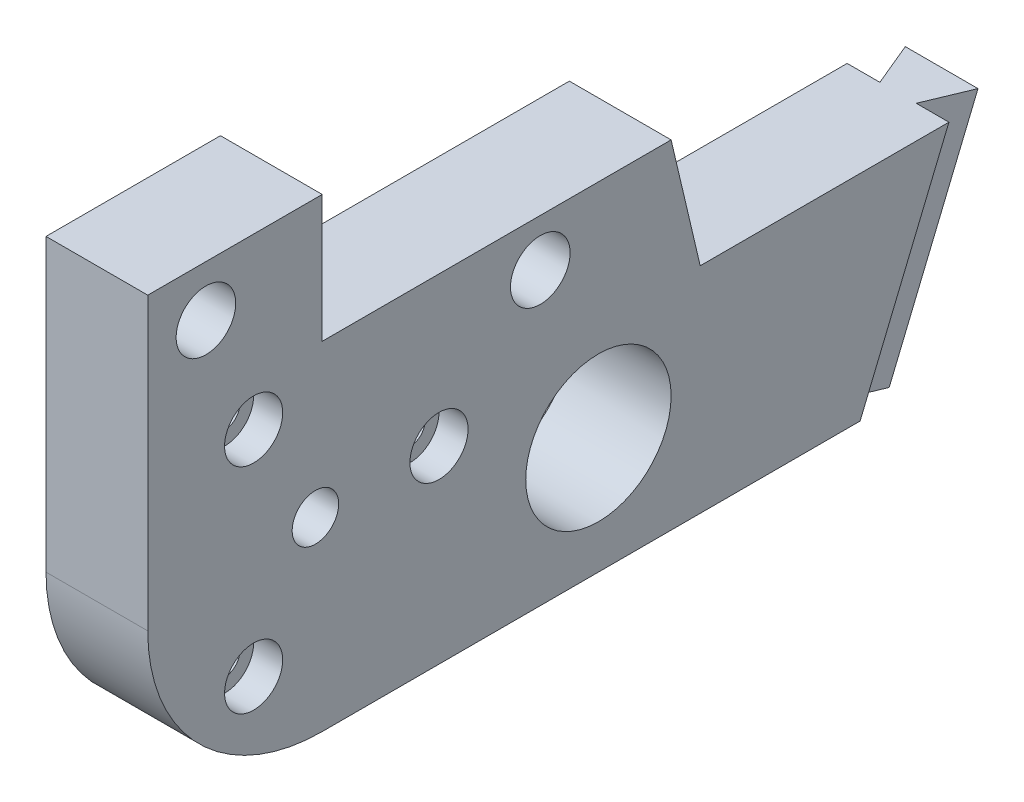
ISO-10303-21;
HEADER;
FILE_DESCRIPTION(('STEP AP214'),'2;1');
FILE_NAME('part.step','',(''),(''),'','','');
FILE_SCHEMA(('AUTOMOTIVE_DESIGN { 1 0 10303 214 1 1 1 1 }'));
ENDSEC;
DATA;
#1=APPLICATION_CONTEXT('core data for automotive mechanical design processes');
#2=APPLICATION_PROTOCOL_DEFINITION('international standard','automotive_design',2000,#1);
#3=PRODUCT_CONTEXT('',#1,'mechanical');
#4=PRODUCT('Part','Part','',(#3));
#5=PRODUCT_RELATED_PRODUCT_CATEGORY('part','',(#4));
#6=PRODUCT_DEFINITION_FORMATION('','',#4);
#7=PRODUCT_DEFINITION_CONTEXT('part definition',#1,'design');
#8=PRODUCT_DEFINITION('design','',#6,#7);
#9=PRODUCT_DEFINITION_SHAPE('','',#8);
#10=(LENGTH_UNIT() NAMED_UNIT(*) SI_UNIT(.MILLI.,.METRE.));
#11=(NAMED_UNIT(*) PLANE_ANGLE_UNIT() SI_UNIT($,.RADIAN.));
#12=(NAMED_UNIT(*) SI_UNIT($,.STERADIAN.) SOLID_ANGLE_UNIT());
#13=UNCERTAINTY_MEASURE_WITH_UNIT(LENGTH_MEASURE(1.E-05),#10,'distance_accuracy_value','');
#14=(GEOMETRIC_REPRESENTATION_CONTEXT(3) GLOBAL_UNCERTAINTY_ASSIGNED_CONTEXT((#13)) GLOBAL_UNIT_ASSIGNED_CONTEXT((#10,
#11,#12)) REPRESENTATION_CONTEXT('',''));
#15=CARTESIAN_POINT('',(0.,0.,0.));
#16=DIRECTION('',(0.,0.,1.));
#17=DIRECTION('',(1.,0.,0.));
#18=AXIS2_PLACEMENT_3D('',#15,#16,#17);
#19=CARTESIAN_POINT('',(5.,-7.99999999999999,-1.));
#20=DIRECTION('',(0.,-1.,0.));
#21=DIRECTION('',(0.,0.,-1.));
#22=AXIS2_PLACEMENT_3D('',#19,#20,#21);
#23=PLANE('',#22);
#24=DIRECTION('',(1.,0.,0.));
#25=VECTOR('',#24,1.);
#26=CARTESIAN_POINT('',(5.,-7.99999999999999,47.));
#27=LINE('',#26,#25);
#28=CARTESIAN_POINT('',(12.,-7.99999999999999,47.));
#29=VERTEX_POINT('',#28);
#30=CARTESIAN_POINT('',(5.,-7.99999999999999,47.));
#31=VERTEX_POINT('',#30);
#32=EDGE_CURVE('E151',#29,#31,#27,.F.);
#33=ORIENTED_EDGE('',*,*,#32,.T.);
#34=DIRECTION('',(0.,0.,-1.));
#35=VECTOR('',#34,1.);
#36=CARTESIAN_POINT('',(5.,-7.99999999999999,-1.));
#37=LINE('',#36,#35);
#38=CARTESIAN_POINT('',(5.,-7.99999999999999,10.));
#39=VERTEX_POINT('',#38);
#40=EDGE_CURVE('E139',#31,#39,#37,.T.);
#41=ORIENTED_EDGE('',*,*,#40,.T.);
#42=DIRECTION('',(-1.,0.,0.));
#43=VECTOR('',#42,1.);
#44=CARTESIAN_POINT('',(5.,-7.99999999999999,10.));
#45=LINE('',#44,#43);
#46=CARTESIAN_POINT('',(7.25,-7.99999999999999,10.));
#47=VERTEX_POINT('',#46);
#48=EDGE_CURVE('E201',#47,#39,#45,.T.);
#49=ORIENTED_EDGE('',*,*,#48,.F.);
#50=DIRECTION('',(0.384615384615385,0.,0.923076923076923));
#51=VECTOR('',#50,1.);
#52=CARTESIAN_POINT('',(7.3972403979656,-7.99999999999999,10.3533769551174));
#53=LINE('',#52,#51);
#54=CARTESIAN_POINT('',(6.,-7.99999999999999,7.));
#55=VERTEX_POINT('',#54);
#56=EDGE_CURVE('E173',#55,#47,#53,.T.);
#57=ORIENTED_EDGE('',*,*,#56,.F.);
#58=DIRECTION('',(1.,0.,0.));
#59=VECTOR('',#58,1.);
#60=CARTESIAN_POINT('',(-2.,-7.99999999999999,7.));
#61=LINE('',#60,#59);
#62=CARTESIAN_POINT('',(11.,-7.99999999999999,7.));
#63=VERTEX_POINT('',#62);
#64=EDGE_CURVE('E256',#55,#63,#61,.T.);
#65=ORIENTED_EDGE('',*,*,#64,.T.);
#66=DIRECTION('',(0.384615384615385,0.,-0.923076923076923));
#67=VECTOR('',#66,1.);
#68=CARTESIAN_POINT('',(9.6027596020344,-7.99999999999999,10.3533769551174));
#69=LINE('',#68,#67);
#70=CARTESIAN_POINT('',(9.75,-7.99999999999999,10.));
#71=VERTEX_POINT('',#70);
#72=EDGE_CURVE('E267',#71,#63,#69,.T.);
#73=ORIENTED_EDGE('',*,*,#72,.F.);
#74=DIRECTION('',(-1.,0.,0.));
#75=VECTOR('',#74,1.);
#76=CARTESIAN_POINT('',(12.,-7.99999999999999,10.));
#77=LINE('',#76,#75);
#78=CARTESIAN_POINT('',(12.,-7.99999999999999,10.));
#79=VERTEX_POINT('',#78);
#80=EDGE_CURVE('E271',#79,#71,#77,.T.);
#81=ORIENTED_EDGE('',*,*,#80,.F.);
#82=DIRECTION('',(0.,0.,1.));
#83=VECTOR('',#82,1.);
#84=CARTESIAN_POINT('',(12.,-7.99999999999999,-1.));
#85=LINE('',#84,#83);
#86=EDGE_CURVE('E50',#79,#29,#85,.T.);
#87=ORIENTED_EDGE('',*,*,#86,.T.);
#88=EDGE_LOOP('',(#33,#41,#49,#57,#65,#73,#81,#87));
#89=FACE_BOUND('',#88,.T.);
#90=ADVANCED_FACE('F35',(#89),#23,.T.);
#91=CARTESIAN_POINT('',(-2.,6.75,-4.00000000000001));
#92=DIRECTION('',(0.,-1.,0.));
#93=DIRECTION('',(0.,0.,-1.));
#94=AXIS2_PLACEMENT_3D('',#91,#92,#93);
#95=PLANE('',#94);
#96=DIRECTION('',(0.,0.,-1.));
#97=VECTOR('',#96,1.);
#98=CARTESIAN_POINT('',(5.,6.75,-4.00000000000001));
#99=LINE('',#98,#97);
#100=CARTESIAN_POINT('',(5.,6.75,21.));
#101=VERTEX_POINT('',#100);
#102=CARTESIAN_POINT('',(5.,6.75,3.89034995499695));
#103=VERTEX_POINT('',#102);
#104=EDGE_CURVE('E230',#101,#103,#99,.T.);
#105=ORIENTED_EDGE('',*,*,#104,.F.);
#106=DIRECTION('',(1.,0.,0.));
#107=VECTOR('',#106,1.);
#108=CARTESIAN_POINT('',(-2.,6.75,21.));
#109=LINE('',#108,#107);
#110=CARTESIAN_POINT('',(12.,6.75,21.));
#111=VERTEX_POINT('',#110);
#112=EDGE_CURVE('E178',#101,#111,#109,.T.);
#113=ORIENTED_EDGE('',*,*,#112,.T.);
#114=DIRECTION('',(0.,0.,-1.));
#115=VECTOR('',#114,1.);
#116=CARTESIAN_POINT('',(12.,6.75,-4.00000000000001));
#117=LINE('',#116,#115);
#118=CARTESIAN_POINT('',(12.,6.75,3.89034995499695));
#119=VERTEX_POINT('',#118);
#120=EDGE_CURVE('E172',#111,#119,#117,.T.);
#121=ORIENTED_EDGE('',*,*,#120,.T.);
#122=DIRECTION('',(1.,0.,0.));
#123=VECTOR('',#122,1.);
#124=CARTESIAN_POINT('',(-2.,6.75,3.89034995499695));
#125=LINE('',#124,#123);
#126=CARTESIAN_POINT('',(9.75,6.75,3.89034995499695));
#127=VERTEX_POINT('',#126);
#128=EDGE_CURVE('E43',#127,#119,#125,.T.);
#129=ORIENTED_EDGE('',*,*,#128,.F.);
#130=DIRECTION('',(-0.384615384615385,0.,0.923076923076923));
#131=VECTOR('',#130,1.);
#132=CARTESIAN_POINT('',(10.8131419958569,6.75,1.33880916494037));
#133=LINE('',#132,#131);
#134=CARTESIAN_POINT('',(11.,6.75,0.89034995499695));
#135=VERTEX_POINT('',#134);
#136=EDGE_CURVE('E156',#135,#127,#133,.T.);
#137=ORIENTED_EDGE('',*,*,#136,.F.);
#138=DIRECTION('',(1.,0.,0.));
#139=VECTOR('',#138,1.);
#140=CARTESIAN_POINT('',(-2.,6.75,0.89034995499695));
#141=LINE('',#140,#139);
#142=CARTESIAN_POINT('',(6.,6.75,0.89034995499695));
#143=VERTEX_POINT('',#142);
#144=EDGE_CURVE('E255',#143,#135,#141,.T.);
#145=ORIENTED_EDGE('',*,*,#144,.F.);
#146=DIRECTION('',(-0.384615384615385,0.,-0.923076923076923));
#147=VECTOR('',#146,1.);
#148=CARTESIAN_POINT('',(3.08034912840345,6.75,-6.11681213683478));
#149=LINE('',#148,#147);
#150=CARTESIAN_POINT('',(7.25,6.75,3.89034995499695));
#151=VERTEX_POINT('',#150);
#152=EDGE_CURVE('E11',#151,#143,#149,.T.);
#153=ORIENTED_EDGE('',*,*,#152,.F.);
#154=DIRECTION('',(1.,0.,0.));
#155=VECTOR('',#154,1.);
#156=CARTESIAN_POINT('',(-2.,6.75,3.89034995499695));
#157=LINE('',#156,#155);
#158=EDGE_CURVE('E204',#103,#151,#157,.T.);
#159=ORIENTED_EDGE('',*,*,#158,.F.);
#160=EDGE_LOOP('',(#105,#113,#121,#129,#137,#145,#153,#159));
#161=FACE_BOUND('',#160,.T.);
#162=ADVANCED_FACE('F176',(#161),#95,.F.);
#163=CARTESIAN_POINT('',(-2.,15.25,47.));
#164=DIRECTION('',(0.,-1.,0.));
#165=DIRECTION('',(0.,0.,-1.));
#166=AXIS2_PLACEMENT_3D('',#163,#164,#165);
#167=PLANE('',#166);
#168=DIRECTION('',(0.,0.,-1.));
#169=VECTOR('',#168,1.);
#170=CARTESIAN_POINT('',(5.,15.25,47.));
#171=LINE('',#170,#169);
#172=CARTESIAN_POINT('',(5.,15.25,47.));
#173=VERTEX_POINT('',#172);
#174=CARTESIAN_POINT('',(5.,15.25,23.));
#175=VERTEX_POINT('',#174);
#176=EDGE_CURVE('E218',#173,#175,#171,.T.);
#177=ORIENTED_EDGE('',*,*,#176,.F.);
#178=DIRECTION('',(1.,0.,0.));
#179=VECTOR('',#178,1.);
#180=CARTESIAN_POINT('',(-2.,15.25,47.));
#181=LINE('',#180,#179);
#182=CARTESIAN_POINT('',(12.,15.25,47.));
#183=VERTEX_POINT('',#182);
#184=EDGE_CURVE('E208',#173,#183,#181,.T.);
#185=ORIENTED_EDGE('',*,*,#184,.T.);
#186=DIRECTION('',(0.,0.,-1.));
#187=VECTOR('',#186,1.);
#188=CARTESIAN_POINT('',(12.,15.25,47.));
#189=LINE('',#188,#187);
#190=CARTESIAN_POINT('',(12.,15.25,23.));
#191=VERTEX_POINT('',#190);
#192=EDGE_CURVE('E192',#183,#191,#189,.T.);
#193=ORIENTED_EDGE('',*,*,#192,.T.);
#194=DIRECTION('',(1.,0.,0.));
#195=VECTOR('',#194,1.);
#196=CARTESIAN_POINT('',(-2.,15.25,23.));
#197=LINE('',#196,#195);
#198=EDGE_CURVE('E206',#175,#191,#197,.T.);
#199=ORIENTED_EDGE('',*,*,#198,.F.);
#200=EDGE_LOOP('',(#177,#185,#193,#199));
#201=FACE_BOUND('',#200,.T.);
#202=ADVANCED_FACE('F215',(#201),#167,.F.);
#203=CARTESIAN_POINT('',(5.,24.,59.));
#204=DIRECTION('',(0.,1.,0.));
#205=DIRECTION('',(0.,0.,1.));
#206=AXIS2_PLACEMENT_3D('',#203,#204,#205);
#207=PLANE('',#206);
#208=DIRECTION('',(1.,0.,0.));
#209=VECTOR('',#208,1.);
#210=CARTESIAN_POINT('',(-2.,24.,47.));
#211=LINE('',#210,#209);
#212=CARTESIAN_POINT('',(5.,24.,47.));
#213=VERTEX_POINT('',#212);
#214=CARTESIAN_POINT('',(12.,24.,47.));
#215=VERTEX_POINT('',#214);
#216=EDGE_CURVE('E210',#213,#215,#211,.T.);
#217=ORIENTED_EDGE('',*,*,#216,.F.);
#218=DIRECTION('',(0.,0.,1.));
#219=VECTOR('',#218,1.);
#220=CARTESIAN_POINT('',(5.,24.,59.));
#221=LINE('',#220,#219);
#222=CARTESIAN_POINT('',(5.,24.,59.));
#223=VERTEX_POINT('',#222);
#224=EDGE_CURVE('E148',#213,#223,#221,.T.);
#225=ORIENTED_EDGE('',*,*,#224,.T.);
#226=DIRECTION('',(-1.,0.,0.));
#227=VECTOR('',#226,1.);
#228=CARTESIAN_POINT('',(5.,24.,59.));
#229=LINE('',#228,#227);
#230=CARTESIAN_POINT('',(12.,24.,59.));
#231=VERTEX_POINT('',#230);
#232=EDGE_CURVE('E141',#231,#223,#229,.T.);
#233=ORIENTED_EDGE('',*,*,#232,.F.);
#234=DIRECTION('',(0.,0.,-1.));
#235=VECTOR('',#234,1.);
#236=CARTESIAN_POINT('',(12.,24.,59.));
#237=LINE('',#236,#235);
#238=EDGE_CURVE('E198',#231,#215,#237,.T.);
#239=ORIENTED_EDGE('',*,*,#238,.T.);
#240=EDGE_LOOP('',(#217,#225,#233,#239));
#241=FACE_BOUND('',#240,.T.);
#242=ADVANCED_FACE('F364',(#241),#207,.T.);
#243=CARTESIAN_POINT('',(5.,-7.99999999999999,59.));
#244=DIRECTION('',(0.,0.,1.));
#245=DIRECTION('',(0.,-1.,0.));
#246=AXIS2_PLACEMENT_3D('',#243,#244,#245);
#247=PLANE('',#246);
#248=ORIENTED_EDGE('',*,*,#232,.T.);
#249=DIRECTION('',(0.,-1.,0.));
#250=VECTOR('',#249,1.);
#251=CARTESIAN_POINT('',(5.,-7.99999999999999,59.));
#252=LINE('',#251,#250);
#253=CARTESIAN_POINT('',(5.,4.00000000000001,59.));
#254=VERTEX_POINT('',#253);
#255=EDGE_CURVE('E136',#223,#254,#252,.T.);
#256=ORIENTED_EDGE('',*,*,#255,.T.);
#257=DIRECTION('',(1.,0.,0.));
#258=VECTOR('',#257,1.);
#259=CARTESIAN_POINT('',(5.,4.00000000000001,59.));
#260=LINE('',#259,#258);
#261=CARTESIAN_POINT('',(12.,4.00000000000001,59.));
#262=VERTEX_POINT('',#261);
#263=EDGE_CURVE('E140',#254,#262,#260,.T.);
#264=ORIENTED_EDGE('',*,*,#263,.T.);
#265=DIRECTION('',(0.,1.,0.));
#266=VECTOR('',#265,1.);
#267=CARTESIAN_POINT('',(12.,-7.99999999999999,59.));
#268=LINE('',#267,#266);
#269=EDGE_CURVE('E195',#262,#231,#268,.T.);
#270=ORIENTED_EDGE('',*,*,#269,.T.);
#271=EDGE_LOOP('',(#248,#256,#264,#270));
#272=FACE_BOUND('',#271,.T.);
#273=ADVANCED_FACE('F145',(#272),#247,.T.);
#274=CARTESIAN_POINT('',(-2.,24.,47.));
#275=DIRECTION('',(0.,0.,1.));
#276=DIRECTION('',(1.,0.,0.));
#277=AXIS2_PLACEMENT_3D('',#274,#275,#276);
#278=PLANE('',#277);
#279=DIRECTION('',(0.,-1.,0.));
#280=VECTOR('',#279,1.);
#281=CARTESIAN_POINT('',(5.,24.,47.));
#282=LINE('',#281,#280);
#283=EDGE_CURVE('E664',#213,#173,#282,.T.);
#284=ORIENTED_EDGE('',*,*,#283,.F.);
#285=ORIENTED_EDGE('',*,*,#216,.T.);
#286=DIRECTION('',(0.,-1.,0.));
#287=VECTOR('',#286,1.);
#288=CARTESIAN_POINT('',(12.,24.,47.));
#289=LINE('',#288,#287);
#290=EDGE_CURVE('E183',#215,#183,#289,.T.);
#291=ORIENTED_EDGE('',*,*,#290,.T.);
#292=ORIENTED_EDGE('',*,*,#184,.F.);
#293=EDGE_LOOP('',(#284,#285,#291,#292));
#294=FACE_BOUND('',#293,.T.);
#295=ADVANCED_FACE('F222',(#294),#278,.F.);
#296=CARTESIAN_POINT('',(-2.,6.75,21.));
#297=DIRECTION('',(0.,-0.229039333725547,0.973417168333576));
#298=DIRECTION('',(0.,-0.973417168333576,-0.229039333725547));
#299=AXIS2_PLACEMENT_3D('',#296,#297,#298);
#300=PLANE('',#299);
#301=DIRECTION('',(0.,-0.973417168333576,-0.229039333725547));
#302=VECTOR('',#301,1.);
#303=CARTESIAN_POINT('',(5.,6.75,21.));
#304=LINE('',#303,#302);
#305=EDGE_CURVE('E228',#175,#101,#304,.T.);
#306=ORIENTED_EDGE('',*,*,#305,.F.);
#307=ORIENTED_EDGE('',*,*,#198,.T.);
#308=DIRECTION('',(0.,-0.973417168333576,-0.229039333725547));
#309=VECTOR('',#308,1.);
#310=CARTESIAN_POINT('',(12.,6.75,21.));
#311=LINE('',#310,#309);
#312=EDGE_CURVE('E180',#191,#111,#311,.T.);
#313=ORIENTED_EDGE('',*,*,#312,.T.);
#314=ORIENTED_EDGE('',*,*,#112,.F.);
#315=EDGE_LOOP('',(#306,#307,#313,#314));
#316=FACE_BOUND('',#315,.T.);
#317=ADVANCED_FACE('F227',(#316),#300,.F.);
#318=CARTESIAN_POINT('',(-2.,0.,28.));
#319=DIRECTION('',(-1.,0.,0.));
#320=DIRECTION('',(0.,0.,1.));
#321=AXIS2_PLACEMENT_3D('',#318,#319,#320);
#322=CYLINDRICAL_SURFACE('',#321,4.99999999999999);
#323=CARTESIAN_POINT('',(12.,0.,28.));
#324=DIRECTION('',(1.,0.,0.));
#325=DIRECTION('',(0.,0.,-1.));
#326=AXIS2_PLACEMENT_3D('',#323,#324,#325);
#327=CIRCLE('',#326,4.99999999999999);
#328=CARTESIAN_POINT('',(12.,0.,23.));
#329=VERTEX_POINT('',#328);
#330=EDGE_CURVE('E181',#329,#329,#327,.T.);
#331=ORIENTED_EDGE('',*,*,#330,.T.);
#332=EDGE_LOOP('',(#331));
#333=FACE_BOUND('',#332,.T.);
#334=CARTESIAN_POINT('',(5.,0.,28.));
#335=DIRECTION('',(-1.,0.,0.));
#336=DIRECTION('',(0.,0.,1.));
#337=AXIS2_PLACEMENT_3D('',#334,#335,#336);
#338=CIRCLE('',#337,4.99999999999999);
#339=CARTESIAN_POINT('',(5.,0.,33.));
#340=VERTEX_POINT('',#339);
#341=EDGE_CURVE('E252',#340,#340,#338,.F.);
#342=ORIENTED_EDGE('',*,*,#341,.F.);
#343=EDGE_LOOP('',(#342));
#344=FACE_BOUND('',#343,.T.);
#345=ADVANCED_FACE('F340',(#333,#344),#322,.F.);
#346=CARTESIAN_POINT('',(-2.,12.3612159321677,51.7181791649861));
#347=DIRECTION('',(-1.,0.,0.));
#348=DIRECTION('',(0.,0.,1.));
#349=AXIS2_PLACEMENT_3D('',#346,#347,#348);
#350=CYLINDRICAL_SURFACE('',#349,1.05000000000001);
#351=CARTESIAN_POINT('',(10.,12.3612159321677,51.7181791649861));
#352=DIRECTION('',(1.,0.,0.));
#353=DIRECTION('',(0.,0.,-1.));
#354=AXIS2_PLACEMENT_3D('',#351,#352,#353);
#355=CIRCLE('',#354,1.05000000000001);
#356=CARTESIAN_POINT('',(10.,12.3612159321677,50.6681791649861));
#357=VERTEX_POINT('',#356);
#358=EDGE_CURVE('E186',#357,#357,#355,.T.);
#359=ORIENTED_EDGE('',*,*,#358,.T.);
#360=EDGE_LOOP('',(#359));
#361=FACE_BOUND('',#360,.T.);
#362=CARTESIAN_POINT('',(5.,12.3612159321677,51.7181791649861));
#363=DIRECTION('',(-1.,0.,0.));
#364=DIRECTION('',(0.,0.,1.));
#365=AXIS2_PLACEMENT_3D('',#362,#363,#364);
#366=CIRCLE('',#365,1.05000000000001);
#367=CARTESIAN_POINT('',(5.,12.3612159321677,52.7681791649862));
#368=VERTEX_POINT('',#367);
#369=EDGE_CURVE('E249',#368,#368,#366,.F.);
#370=ORIENTED_EDGE('',*,*,#369,.F.);
#371=EDGE_LOOP('',(#370));
#372=FACE_BOUND('',#371,.T.);
#373=ADVANCED_FACE('F317',(#361,#372),#350,.F.);
#374=CARTESIAN_POINT('',(-2.,-2.36121593216772,51.7181791649861));
#375=DIRECTION('',(-1.,0.,0.));
#376=DIRECTION('',(0.,0.,1.));
#377=AXIS2_PLACEMENT_3D('',#374,#375,#376);
#378=CYLINDRICAL_SURFACE('',#377,1.05000000000001);
#379=CARTESIAN_POINT('',(10.,-2.36121593216772,51.7181791649861));
#380=DIRECTION('',(1.,0.,0.));
#381=DIRECTION('',(0.,0.,-1.));
#382=AXIS2_PLACEMENT_3D('',#379,#380,#381);
#383=CIRCLE('',#382,1.05000000000001);
#384=CARTESIAN_POINT('',(10.,-2.36121593216772,50.6681791649861));
#385=VERTEX_POINT('',#384);
#386=EDGE_CURVE('E306',#385,#385,#383,.T.);
#387=ORIENTED_EDGE('',*,*,#386,.T.);
#388=EDGE_LOOP('',(#387));
#389=FACE_BOUND('',#388,.T.);
#390=CARTESIAN_POINT('',(5.,-2.36121593216772,51.7181791649861));
#391=DIRECTION('',(-1.,0.,0.));
#392=DIRECTION('',(0.,0.,1.));
#393=AXIS2_PLACEMENT_3D('',#390,#391,#392);
#394=CIRCLE('',#393,1.05000000000001);
#395=CARTESIAN_POINT('',(5.,-2.36121593216772,52.7681791649862));
#396=VERTEX_POINT('',#395);
#397=EDGE_CURVE('E246',#396,#396,#394,.F.);
#398=ORIENTED_EDGE('',*,*,#397,.F.);
#399=EDGE_LOOP('',(#398));
#400=FACE_BOUND('',#399,.T.);
#401=ADVANCED_FACE('F419',(#389,#400),#378,.F.);
#402=CARTESIAN_POINT('',(-2.,4.99999999999998,38.9681791649861));
#403=DIRECTION('',(-1.,0.,0.));
#404=DIRECTION('',(0.,0.,1.));
#405=AXIS2_PLACEMENT_3D('',#402,#403,#404);
#406=CYLINDRICAL_SURFACE('',#405,1.05000000000001);
#407=CARTESIAN_POINT('',(10.,4.99999999999998,38.9681791649861));
#408=DIRECTION('',(1.,0.,0.));
#409=DIRECTION('',(0.,0.,-1.));
#410=AXIS2_PLACEMENT_3D('',#407,#408,#409);
#411=CIRCLE('',#410,1.05000000000001);
#412=CARTESIAN_POINT('',(10.,4.99999999999998,37.9181791649861));
#413=VERTEX_POINT('',#412);
#414=EDGE_CURVE('E297',#413,#413,#411,.T.);
#415=ORIENTED_EDGE('',*,*,#414,.T.);
#416=EDGE_LOOP('',(#415));
#417=FACE_BOUND('',#416,.T.);
#418=CARTESIAN_POINT('',(5.,4.99999999999998,38.9681791649861));
#419=DIRECTION('',(-1.,0.,0.));
#420=DIRECTION('',(0.,0.,1.));
#421=AXIS2_PLACEMENT_3D('',#418,#419,#420);
#422=CIRCLE('',#421,1.05000000000001);
#423=CARTESIAN_POINT('',(5.,4.99999999999998,40.0181791649862));
#424=VERTEX_POINT('',#423);
#425=EDGE_CURVE('E243',#424,#424,#422,.F.);
#426=ORIENTED_EDGE('',*,*,#425,.F.);
#427=EDGE_LOOP('',(#426));
#428=FACE_BOUND('',#427,.T.);
#429=ADVANCED_FACE('F429',(#417,#428),#406,.F.);
#430=CARTESIAN_POINT('',(5.,5.,47.4681791649861));
#431=DIRECTION('',(1.,0.,0.));
#432=DIRECTION('',(0.,0.,-1.));
#433=AXIS2_PLACEMENT_3D('',#430,#431,#432);
#434=CYLINDRICAL_SURFACE('',#433,5.1);
#435=CARTESIAN_POINT('',(6.,5.,47.4681791649861));
#436=DIRECTION('',(-1.,0.,0.));
#437=DIRECTION('',(0.,0.,1.));
#438=AXIS2_PLACEMENT_3D('',#435,#436,#437);
#439=CIRCLE('',#438,5.1);
#440=CARTESIAN_POINT('',(6.,5.,52.5681791649861));
#441=VERTEX_POINT('',#440);
#442=EDGE_CURVE('E282',#441,#441,#439,.T.);
#443=ORIENTED_EDGE('',*,*,#442,.F.);
#444=EDGE_LOOP('',(#443));
#445=FACE_BOUND('',#444,.T.);
#446=CARTESIAN_POINT('',(5.,5.,47.4681791649861));
#447=DIRECTION('',(-1.,0.,0.));
#448=DIRECTION('',(0.,0.,1.));
#449=AXIS2_PLACEMENT_3D('',#446,#447,#448);
#450=CIRCLE('',#449,5.1);
#451=CARTESIAN_POINT('',(5.,5.,52.5681791649861));
#452=VERTEX_POINT('',#451);
#453=EDGE_CURVE('E240',#452,#452,#450,.F.);
#454=ORIENTED_EDGE('',*,*,#453,.F.);
#455=EDGE_LOOP('',(#454));
#456=FACE_BOUND('',#455,.T.);
#457=ADVANCED_FACE('F440',(#445,#456),#434,.F.);
#458=CARTESIAN_POINT('',(-2.,12.,32.));
#459=DIRECTION('',(-1.,0.,0.));
#460=DIRECTION('',(0.,0.,1.));
#461=AXIS2_PLACEMENT_3D('',#458,#459,#460);
#462=CYLINDRICAL_SURFACE('',#461,2.04999999999999);
#463=CARTESIAN_POINT('',(12.,12.,32.));
#464=DIRECTION('',(1.,0.,0.));
#465=DIRECTION('',(0.,0.,-1.));
#466=AXIS2_PLACEMENT_3D('',#463,#464,#465);
#467=CIRCLE('',#466,2.04999999999998);
#468=CARTESIAN_POINT('',(12.,12.,29.95));
#469=VERTEX_POINT('',#468);
#470=EDGE_CURVE('E279',#469,#469,#467,.T.);
#471=ORIENTED_EDGE('',*,*,#470,.T.);
#472=EDGE_LOOP('',(#471));
#473=FACE_BOUND('',#472,.T.);
#474=CARTESIAN_POINT('',(5.,12.,32.));
#475=DIRECTION('',(-1.,0.,0.));
#476=DIRECTION('',(0.,0.,1.));
#477=AXIS2_PLACEMENT_3D('',#474,#475,#476);
#478=CIRCLE('',#477,2.04999999999999);
#479=CARTESIAN_POINT('',(5.,12.,34.05));
#480=VERTEX_POINT('',#479);
#481=EDGE_CURVE('E233',#480,#480,#478,.F.);
#482=ORIENTED_EDGE('',*,*,#481,.F.);
#483=EDGE_LOOP('',(#482));
#484=FACE_BOUND('',#483,.T.);
#485=ADVANCED_FACE('F451',(#473,#484),#462,.F.);
#486=CARTESIAN_POINT('',(5.,20.5,55.));
#487=DIRECTION('',(1.,0.,0.));
#488=DIRECTION('',(0.,0.,-1.));
#489=AXIS2_PLACEMENT_3D('',#486,#487,#488);
#490=CYLINDRICAL_SURFACE('',#489,2.04999999999999);
#491=CARTESIAN_POINT('',(12.,20.5,55.));
#492=DIRECTION('',(-1.,0.,0.));
#493=DIRECTION('',(0.,0.,1.));
#494=AXIS2_PLACEMENT_3D('',#491,#492,#493);
#495=CIRCLE('',#494,2.05);
#496=CARTESIAN_POINT('',(12.,20.5,57.05));
#497=VERTEX_POINT('',#496);
#498=EDGE_CURVE('E270',#497,#497,#495,.T.);
#499=ORIENTED_EDGE('',*,*,#498,.F.);
#500=EDGE_LOOP('',(#499));
#501=FACE_BOUND('',#500,.T.);
#502=CARTESIAN_POINT('',(5.,20.5,55.));
#503=DIRECTION('',(-1.,0.,0.));
#504=DIRECTION('',(0.,0.,1.));
#505=AXIS2_PLACEMENT_3D('',#502,#503,#504);
#506=CIRCLE('',#505,2.04999999999999);
#507=CARTESIAN_POINT('',(5.,20.5,57.05));
#508=VERTEX_POINT('',#507);
#509=EDGE_CURVE('E229',#508,#508,#506,.F.);
#510=ORIENTED_EDGE('',*,*,#509,.F.);
#511=EDGE_LOOP('',(#510));
#512=FACE_BOUND('',#511,.T.);
#513=ADVANCED_FACE('F462',(#501,#512),#490,.F.);
#514=CARTESIAN_POINT('',(5.,-9.00123984004869,10.4147271209364));
#515=DIRECTION('',(0.,-0.382683432365084,-0.923879532511289));
#516=DIRECTION('',(0.,0.923879532511289,-0.382683432365084));
#517=AXIS2_PLACEMENT_3D('',#514,#515,#516);
#518=PLANE('',#517);
#519=ORIENTED_EDGE('',*,*,#48,.T.);
#520=DIRECTION('',(0.,0.923879532511289,-0.382683432365084));
#521=VECTOR('',#520,1.);
#522=CARTESIAN_POINT('',(5.,-9.00123984004869,10.4147271209364));
#523=LINE('',#522,#521);
#524=EDGE_CURVE('E663',#39,#103,#523,.T.);
#525=ORIENTED_EDGE('',*,*,#524,.T.);
#526=ORIENTED_EDGE('',*,*,#158,.T.);
#527=DIRECTION('',(0.,0.923879532511289,-0.382683432365084));
#528=VECTOR('',#527,1.);
#529=CARTESIAN_POINT('',(7.25,-9.00123984004869,10.4147271209364));
#530=LINE('',#529,#528);
#531=EDGE_CURVE('E263',#47,#151,#530,.T.);
#532=ORIENTED_EDGE('',*,*,#531,.F.);
#533=EDGE_LOOP('',(#519,#525,#526,#532));
#534=FACE_BOUND('',#533,.T.);
#535=ADVANCED_FACE('F335',(#534),#518,.T.);
#536=CARTESIAN_POINT('',(12.,0.,0.));
#537=DIRECTION('',(1.,0.,0.));
#538=DIRECTION('',(0.,0.,1.));
#539=AXIS2_PLACEMENT_3D('',#536,#537,#538);
#540=PLANE('',#539);
#541=ORIENTED_EDGE('',*,*,#498,.T.);
#542=EDGE_LOOP('',(#541));
#543=FACE_BOUND('',#542,.T.);
#544=ORIENTED_EDGE('',*,*,#470,.F.);
#545=EDGE_LOOP('',(#544));
#546=FACE_BOUND('',#545,.T.);
#547=CARTESIAN_POINT('',(12.,5.,47.4681791649861));
#548=DIRECTION('',(-1.,0.,0.));
#549=DIRECTION('',(0.,0.,1.));
#550=AXIS2_PLACEMENT_3D('',#547,#548,#549);
#551=CIRCLE('',#550,1.6);
#552=CARTESIAN_POINT('',(12.,5.,49.0681791649861));
#553=VERTEX_POINT('',#552);
#554=EDGE_CURVE('E288',#553,#553,#551,.T.);
#555=ORIENTED_EDGE('',*,*,#554,.T.);
#556=EDGE_LOOP('',(#555));
#557=FACE_BOUND('',#556,.T.);
#558=CARTESIAN_POINT('',(12.,4.99999999999998,38.9681791649861));
#559=DIRECTION('',(1.,0.,0.));
#560=DIRECTION('',(0.,0.,-1.));
#561=AXIS2_PLACEMENT_3D('',#558,#559,#560);
#562=CIRCLE('',#561,1.99999999999999);
#563=CARTESIAN_POINT('',(12.,4.99999999999998,36.9681791649861));
#564=VERTEX_POINT('',#563);
#565=EDGE_CURVE('E291',#564,#564,#562,.T.);
#566=ORIENTED_EDGE('',*,*,#565,.F.);
#567=EDGE_LOOP('',(#566));
#568=FACE_BOUND('',#567,.T.);
#569=CARTESIAN_POINT('',(12.,-2.36121593216772,51.7181791649861));
#570=DIRECTION('',(1.,0.,0.));
#571=DIRECTION('',(0.,0.,-1.));
#572=AXIS2_PLACEMENT_3D('',#569,#570,#571);
#573=CIRCLE('',#572,1.99999999999999);
#574=CARTESIAN_POINT('',(12.,-2.36121593216772,49.7181791649861));
#575=VERTEX_POINT('',#574);
#576=EDGE_CURVE('E300',#575,#575,#573,.T.);
#577=ORIENTED_EDGE('',*,*,#576,.F.);
#578=EDGE_LOOP('',(#577));
#579=FACE_BOUND('',#578,.T.);
#580=CARTESIAN_POINT('',(12.,12.3612159321677,51.7181791649861));
#581=DIRECTION('',(1.,0.,0.));
#582=DIRECTION('',(0.,0.,-1.));
#583=AXIS2_PLACEMENT_3D('',#580,#581,#582);
#584=CIRCLE('',#583,1.99999999999999);
#585=CARTESIAN_POINT('',(12.,12.3612159321677,49.7181791649861));
#586=VERTEX_POINT('',#585);
#587=EDGE_CURVE('E309',#586,#586,#584,.T.);
#588=ORIENTED_EDGE('',*,*,#587,.F.);
#589=EDGE_LOOP('',(#588));
#590=FACE_BOUND('',#589,.T.);
#591=ORIENTED_EDGE('',*,*,#330,.F.);
#592=EDGE_LOOP('',(#591));
#593=FACE_BOUND('',#592,.T.);
#594=ORIENTED_EDGE('',*,*,#86,.F.);
#595=DIRECTION('',(0.,0.923879532511289,-0.382683432365084));
#596=VECTOR('',#595,1.);
#597=CARTESIAN_POINT('',(12.,-9.00123984004869,10.4147271209364));
#598=LINE('',#597,#596);
#599=EDGE_CURVE('E163',#79,#119,#598,.T.);
#600=ORIENTED_EDGE('',*,*,#599,.T.);
#601=ORIENTED_EDGE('',*,*,#120,.F.);
#602=ORIENTED_EDGE('',*,*,#312,.F.);
#603=ORIENTED_EDGE('',*,*,#192,.F.);
#604=ORIENTED_EDGE('',*,*,#290,.F.);
#605=ORIENTED_EDGE('',*,*,#238,.F.);
#606=ORIENTED_EDGE('',*,*,#269,.F.);
#607=CARTESIAN_POINT('',(12.,4.00000000000001,47.));
#608=DIRECTION('',(1.,0.,0.));
#609=DIRECTION('',(0.,0.,-1.));
#610=AXIS2_PLACEMENT_3D('',#607,#608,#609);
#611=CIRCLE('',#610,12.);
#612=EDGE_CURVE('E57',#262,#29,#611,.T.);
#613=ORIENTED_EDGE('',*,*,#612,.T.);
#614=EDGE_LOOP('',(#594,#600,#601,#602,#603,#604,#605,#606,#613));
#615=FACE_BOUND('',#614,.T.);
#616=ADVANCED_FACE('F170',(#543,#546,#557,#568,#579,#590,#593,#615),#540,.T.);
#617=CARTESIAN_POINT('',(10.,13.4112159321677,51.7181791649861));
#618=DIRECTION('',(-1.,0.,0.));
#619=DIRECTION('',(0.,0.,1.));
#620=AXIS2_PLACEMENT_3D('',#617,#618,#619);
#621=PLANE('',#620);
#622=ORIENTED_EDGE('',*,*,#358,.F.);
#623=EDGE_LOOP('',(#622));
#624=FACE_BOUND('',#623,.T.);
#625=CARTESIAN_POINT('',(10.,12.3612159321677,51.7181791649861));
#626=DIRECTION('',(1.,0.,0.));
#627=DIRECTION('',(0.,0.,-1.));
#628=AXIS2_PLACEMENT_3D('',#625,#626,#627);
#629=CIRCLE('',#628,1.99999999999999);
#630=CARTESIAN_POINT('',(10.,12.3612159321677,49.7181791649861));
#631=VERTEX_POINT('',#630);
#632=EDGE_CURVE('E312',#631,#631,#629,.T.);
#633=ORIENTED_EDGE('',*,*,#632,.T.);
#634=EDGE_LOOP('',(#633));
#635=FACE_BOUND('',#634,.T.);
#636=ADVANCED_FACE('F320',(#624,#635),#621,.F.);
#637=CARTESIAN_POINT('',(12.,12.3612159321677,51.7181791649861));
#638=DIRECTION('',(1.,0.,0.));
#639=DIRECTION('',(0.,0.,-1.));
#640=AXIS2_PLACEMENT_3D('',#637,#638,#639);
#641=CYLINDRICAL_SURFACE('',#640,1.99999999999999);
#642=ORIENTED_EDGE('',*,*,#632,.F.);
#643=EDGE_LOOP('',(#642));
#644=FACE_BOUND('',#643,.T.);
#645=ORIENTED_EDGE('',*,*,#587,.T.);
#646=EDGE_LOOP('',(#645));
#647=FACE_BOUND('',#646,.T.);
#648=ADVANCED_FACE('F323',(#644,#647),#641,.F.);
#649=CARTESIAN_POINT('',(10.,-1.31121593216771,51.7181791649861));
#650=DIRECTION('',(-1.,0.,0.));
#651=DIRECTION('',(0.,0.,1.));
#652=AXIS2_PLACEMENT_3D('',#649,#650,#651);
#653=PLANE('',#652);
#654=ORIENTED_EDGE('',*,*,#386,.F.);
#655=EDGE_LOOP('',(#654));
#656=FACE_BOUND('',#655,.T.);
#657=CARTESIAN_POINT('',(10.,-2.36121593216772,51.7181791649861));
#658=DIRECTION('',(1.,0.,0.));
#659=DIRECTION('',(0.,0.,-1.));
#660=AXIS2_PLACEMENT_3D('',#657,#658,#659);
#661=CIRCLE('',#660,1.99999999999999);
#662=CARTESIAN_POINT('',(10.,-2.36121593216772,49.7181791649861));
#663=VERTEX_POINT('',#662);
#664=EDGE_CURVE('E303',#663,#663,#661,.T.);
#665=ORIENTED_EDGE('',*,*,#664,.T.);
#666=EDGE_LOOP('',(#665));
#667=FACE_BOUND('',#666,.T.);
#668=ADVANCED_FACE('F329',(#656,#667),#653,.F.);
#669=CARTESIAN_POINT('',(12.,-2.36121593216772,51.7181791649861));
#670=DIRECTION('',(1.,0.,0.));
#671=DIRECTION('',(0.,0.,-1.));
#672=AXIS2_PLACEMENT_3D('',#669,#670,#671);
#673=CYLINDRICAL_SURFACE('',#672,1.99999999999999);
#674=ORIENTED_EDGE('',*,*,#664,.F.);
#675=EDGE_LOOP('',(#674));
#676=FACE_BOUND('',#675,.T.);
#677=ORIENTED_EDGE('',*,*,#576,.T.);
#678=EDGE_LOOP('',(#677));
#679=FACE_BOUND('',#678,.T.);
#680=ADVANCED_FACE('F587',(#676,#679),#673,.F.);
#681=CARTESIAN_POINT('',(10.,6.05,38.9681791649861));
#682=DIRECTION('',(-1.,0.,0.));
#683=DIRECTION('',(0.,0.,1.));
#684=AXIS2_PLACEMENT_3D('',#681,#682,#683);
#685=PLANE('',#684);
#686=ORIENTED_EDGE('',*,*,#414,.F.);
#687=EDGE_LOOP('',(#686));
#688=FACE_BOUND('',#687,.T.);
#689=CARTESIAN_POINT('',(10.,4.99999999999998,38.9681791649861));
#690=DIRECTION('',(1.,0.,0.));
#691=DIRECTION('',(0.,0.,-1.));
#692=AXIS2_PLACEMENT_3D('',#689,#690,#691);
#693=CIRCLE('',#692,1.99999999999999);
#694=CARTESIAN_POINT('',(10.,4.99999999999998,36.9681791649861));
#695=VERTEX_POINT('',#694);
#696=EDGE_CURVE('E294',#695,#695,#693,.T.);
#697=ORIENTED_EDGE('',*,*,#696,.T.);
#698=EDGE_LOOP('',(#697));
#699=FACE_BOUND('',#698,.T.);
#700=ADVANCED_FACE('F577',(#688,#699),#685,.F.);
#701=CARTESIAN_POINT('',(12.,4.99999999999998,38.9681791649861));
#702=DIRECTION('',(1.,0.,0.));
#703=DIRECTION('',(0.,0.,-1.));
#704=AXIS2_PLACEMENT_3D('',#701,#702,#703);
#705=CYLINDRICAL_SURFACE('',#704,1.99999999999999);
#706=ORIENTED_EDGE('',*,*,#696,.F.);
#707=EDGE_LOOP('',(#706));
#708=FACE_BOUND('',#707,.T.);
#709=ORIENTED_EDGE('',*,*,#565,.T.);
#710=EDGE_LOOP('',(#709));
#711=FACE_BOUND('',#710,.T.);
#712=ADVANCED_FACE('F567',(#708,#711),#705,.F.);
#713=CARTESIAN_POINT('',(5.,5.,47.4681791649861));
#714=DIRECTION('',(-1.,0.,0.));
#715=DIRECTION('',(0.,0.,1.));
#716=AXIS2_PLACEMENT_3D('',#713,#714,#715);
#717=CYLINDRICAL_SURFACE('',#716,1.6);
#718=ORIENTED_EDGE('',*,*,#554,.F.);
#719=EDGE_LOOP('',(#718));
#720=FACE_BOUND('',#719,.T.);
#721=CARTESIAN_POINT('',(6.,5.,47.4681791649861));
#722=DIRECTION('',(-1.,0.,0.));
#723=DIRECTION('',(0.,0.,1.));
#724=AXIS2_PLACEMENT_3D('',#721,#722,#723);
#725=CIRCLE('',#724,1.60000000000001);
#726=CARTESIAN_POINT('',(6.,5.,49.0681791649862));
#727=VERTEX_POINT('',#726);
#728=EDGE_CURVE('E285',#727,#727,#725,.T.);
#729=ORIENTED_EDGE('',*,*,#728,.T.);
#730=EDGE_LOOP('',(#729));
#731=FACE_BOUND('',#730,.T.);
#732=ADVANCED_FACE('F557',(#720,#731),#717,.F.);
#733=CARTESIAN_POINT('',(6.,6.60000000000001,47.4681791649861));
#734=DIRECTION('',(1.,0.,0.));
#735=DIRECTION('',(0.,0.,-1.));
#736=AXIS2_PLACEMENT_3D('',#733,#734,#735);
#737=PLANE('',#736);
#738=ORIENTED_EDGE('',*,*,#728,.F.);
#739=EDGE_LOOP('',(#738));
#740=FACE_BOUND('',#739,.T.);
#741=ORIENTED_EDGE('',*,*,#442,.T.);
#742=EDGE_LOOP('',(#741));
#743=FACE_BOUND('',#742,.T.);
#744=ADVANCED_FACE('F492',(#740,#743),#737,.F.);
#745=CARTESIAN_POINT('',(5.,4.00000000000001,47.));
#746=DIRECTION('',(1.,0.,0.));
#747=DIRECTION('',(0.,0.,-1.));
#748=AXIS2_PLACEMENT_3D('',#745,#746,#747);
#749=CYLINDRICAL_SURFACE('',#748,12.);
#750=CARTESIAN_POINT('',(5.,4.00000000000001,47.));
#751=DIRECTION('',(-1.,0.,0.));
#752=DIRECTION('',(0.,0.,1.));
#753=AXIS2_PLACEMENT_3D('',#750,#751,#752);
#754=CIRCLE('',#753,12.);
#755=EDGE_CURVE('E132',#254,#31,#754,.F.);
#756=ORIENTED_EDGE('',*,*,#755,.T.);
#757=ORIENTED_EDGE('',*,*,#32,.F.);
#758=ORIENTED_EDGE('',*,*,#612,.F.);
#759=ORIENTED_EDGE('',*,*,#263,.F.);
#760=EDGE_LOOP('',(#756,#757,#758,#759));
#761=FACE_BOUND('',#760,.T.);
#762=ADVANCED_FACE('F37',(#761),#749,.T.);
#763=CARTESIAN_POINT('',(12.,-9.00123984004869,10.4147271209364));
#764=DIRECTION('',(0.,-0.382683432365084,-0.923879532511289));
#765=DIRECTION('',(0.,0.923879532511289,-0.382683432365084));
#766=AXIS2_PLACEMENT_3D('',#763,#764,#765);
#767=PLANE('',#766);
#768=ORIENTED_EDGE('',*,*,#128,.T.);
#769=ORIENTED_EDGE('',*,*,#599,.F.);
#770=ORIENTED_EDGE('',*,*,#80,.T.);
#771=DIRECTION('',(0.,0.923879532511289,-0.382683432365084));
#772=VECTOR('',#771,1.);
#773=CARTESIAN_POINT('',(9.75,-9.00123984004869,10.4147271209364));
#774=LINE('',#773,#772);
#775=EDGE_CURVE('E164',#71,#127,#774,.T.);
#776=ORIENTED_EDGE('',*,*,#775,.T.);
#777=EDGE_LOOP('',(#768,#769,#770,#776));
#778=FACE_BOUND('',#777,.T.);
#779=ADVANCED_FACE('F161',(#778),#767,.T.);
#780=CARTESIAN_POINT('',(9.75,-9.00123984004869,10.4147271209364));
#781=DIRECTION('',(0.911581168523075,0.157328868002569,0.379825486884615));
#782=DIRECTION('',(0.384615384615385,0.,-0.923076923076923));
#783=AXIS2_PLACEMENT_3D('',#780,#781,#782);
#784=PLANE('',#783);
#785=ORIENTED_EDGE('',*,*,#136,.T.);
#786=ORIENTED_EDGE('',*,*,#775,.F.);
#787=ORIENTED_EDGE('',*,*,#72,.T.);
#788=DIRECTION('',(0.,0.923879532511289,-0.382683432365084));
#789=VECTOR('',#788,1.);
#790=CARTESIAN_POINT('',(11.,-9.00123984004869,7.41472712093643));
#791=LINE('',#790,#789);
#792=EDGE_CURVE('E273',#63,#135,#791,.T.);
#793=ORIENTED_EDGE('',*,*,#792,.T.);
#794=EDGE_LOOP('',(#785,#786,#787,#793));
#795=FACE_BOUND('',#794,.T.);
#796=ADVANCED_FACE('F533',(#795),#784,.T.);
#797=CARTESIAN_POINT('',(7.25,-9.00123984004869,10.4147271209364));
#798=DIRECTION('',(-0.911581168523075,0.157328868002569,0.379825486884615));
#799=DIRECTION('',(0.384615384615385,0.,0.923076923076923));
#800=AXIS2_PLACEMENT_3D('',#797,#798,#799);
#801=PLANE('',#800);
#802=ORIENTED_EDGE('',*,*,#152,.T.);
#803=DIRECTION('',(0.,0.923879532511289,-0.382683432365084));
#804=VECTOR('',#803,1.);
#805=CARTESIAN_POINT('',(6.,-9.00123984004869,7.41472712093643));
#806=LINE('',#805,#804);
#807=EDGE_CURVE('E259',#55,#143,#806,.T.);
#808=ORIENTED_EDGE('',*,*,#807,.F.);
#809=ORIENTED_EDGE('',*,*,#56,.T.);
#810=ORIENTED_EDGE('',*,*,#531,.T.);
#811=EDGE_LOOP('',(#802,#808,#809,#810));
#812=FACE_BOUND('',#811,.T.);
#813=ADVANCED_FACE('F352',(#812),#801,.T.);
#814=CARTESIAN_POINT('',(-2.,6.75,0.89034995499695));
#815=DIRECTION('',(0.,-0.382683432365084,-0.923879532511289));
#816=DIRECTION('',(0.,0.923879532511289,-0.382683432365084));
#817=AXIS2_PLACEMENT_3D('',#814,#815,#816);
#818=PLANE('',#817);
#819=ORIENTED_EDGE('',*,*,#64,.F.);
#820=ORIENTED_EDGE('',*,*,#807,.T.);
#821=ORIENTED_EDGE('',*,*,#144,.T.);
#822=ORIENTED_EDGE('',*,*,#792,.F.);
#823=EDGE_LOOP('',(#819,#820,#821,#822));
#824=FACE_BOUND('',#823,.T.);
#825=ADVANCED_FACE('F347',(#824),#818,.T.);
#826=CARTESIAN_POINT('',(5.,0.,0.));
#827=DIRECTION('',(-1.,0.,0.));
#828=DIRECTION('',(0.,0.,1.));
#829=AXIS2_PLACEMENT_3D('',#826,#827,#828);
#830=PLANE('',#829);
#831=ORIENTED_EDGE('',*,*,#305,.T.);
#832=ORIENTED_EDGE('',*,*,#104,.T.);
#833=ORIENTED_EDGE('',*,*,#524,.F.);
#834=ORIENTED_EDGE('',*,*,#40,.F.);
#835=ORIENTED_EDGE('',*,*,#755,.F.);
#836=ORIENTED_EDGE('',*,*,#255,.F.);
#837=ORIENTED_EDGE('',*,*,#224,.F.);
#838=ORIENTED_EDGE('',*,*,#283,.T.);
#839=ORIENTED_EDGE('',*,*,#176,.T.);
#840=EDGE_LOOP('',(#831,#832,#833,#834,#835,#836,#837,#838,#839));
#841=FACE_BOUND('',#840,.T.);
#842=ORIENTED_EDGE('',*,*,#509,.T.);
#843=EDGE_LOOP('',(#842));
#844=FACE_BOUND('',#843,.T.);
#845=ORIENTED_EDGE('',*,*,#481,.T.);
#846=EDGE_LOOP('',(#845));
#847=FACE_BOUND('',#846,.T.);
#848=ORIENTED_EDGE('',*,*,#453,.T.);
#849=EDGE_LOOP('',(#848));
#850=FACE_BOUND('',#849,.T.);
#851=ORIENTED_EDGE('',*,*,#425,.T.);
#852=EDGE_LOOP('',(#851));
#853=FACE_BOUND('',#852,.T.);
#854=ORIENTED_EDGE('',*,*,#397,.T.);
#855=EDGE_LOOP('',(#854));
#856=FACE_BOUND('',#855,.T.);
#857=ORIENTED_EDGE('',*,*,#369,.T.);
#858=EDGE_LOOP('',(#857));
#859=FACE_BOUND('',#858,.T.);
#860=ORIENTED_EDGE('',*,*,#341,.T.);
#861=EDGE_LOOP('',(#860));
#862=FACE_BOUND('',#861,.T.);
#863=ADVANCED_FACE('F134',(#841,#844,#847,#850,#853,#856,#859,#862),#830,.T.);
#864=CLOSED_SHELL('',(#90,#162,#202,#242,#273,#295,#317,#345,#373,#401,#429,#457,#485,#513,#535,
#616,#636,#648,#668,#680,#700,#712,#732,#744,#762,#779,#796,#813,#825,#863));
#865=MANIFOLD_SOLID_BREP('B2',#864);
#866=ADVANCED_BREP_SHAPE_REPRESENTATION('',(#18,#865),#14);
#867=SHAPE_DEFINITION_REPRESENTATION(#9,#866);
ENDSEC;
END-ISO-10303-21;
